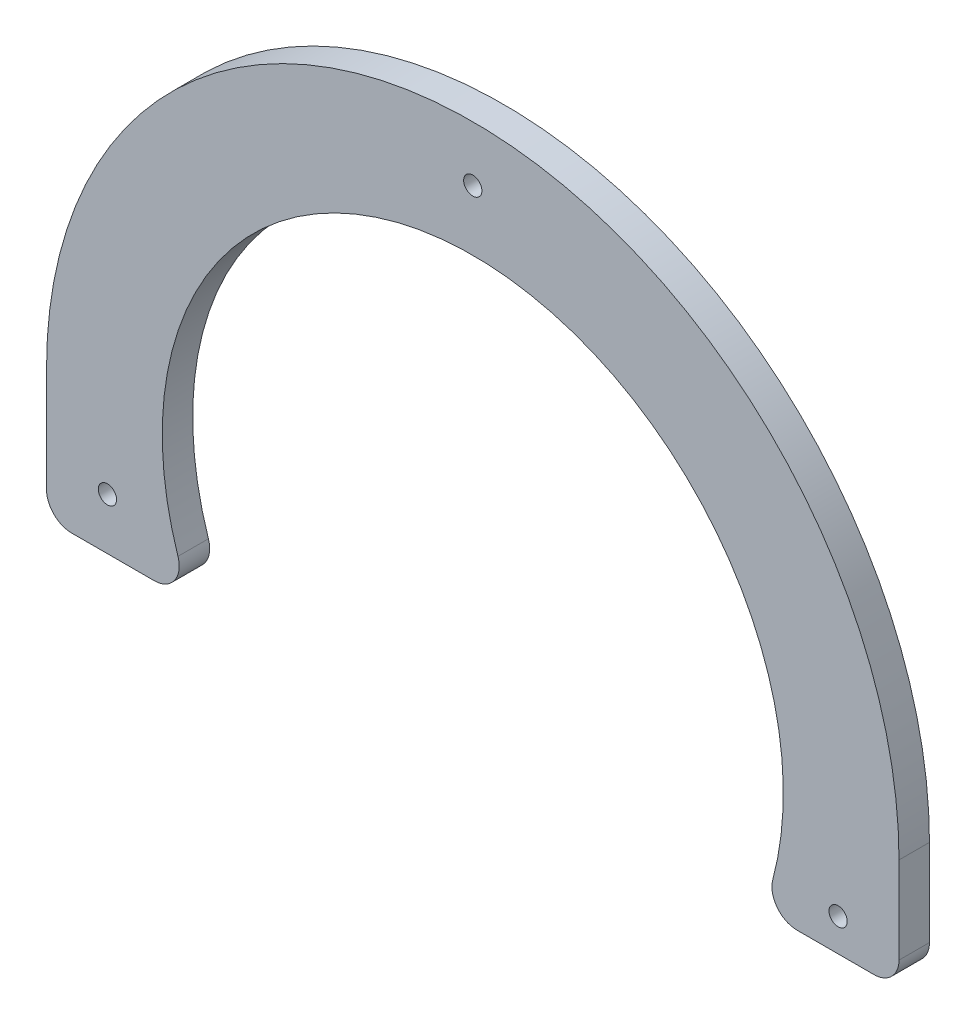
ISO-10303-21;
HEADER;
FILE_DESCRIPTION(('STEP AP214'),'2;1');
FILE_NAME('part.step','',(''),(''),'','','');
FILE_SCHEMA(('AUTOMOTIVE_DESIGN { 1 0 10303 214 1 1 1 1 }'));
ENDSEC;
DATA;
#1=APPLICATION_CONTEXT('core data for automotive mechanical design processes');
#2=APPLICATION_PROTOCOL_DEFINITION('international standard','automotive_design',2000,#1);
#3=PRODUCT_CONTEXT('',#1,'mechanical');
#4=PRODUCT('Part','Part','',(#3));
#5=PRODUCT_RELATED_PRODUCT_CATEGORY('part','',(#4));
#6=PRODUCT_DEFINITION_FORMATION('','',#4);
#7=PRODUCT_DEFINITION_CONTEXT('part definition',#1,'design');
#8=PRODUCT_DEFINITION('design','',#6,#7);
#9=PRODUCT_DEFINITION_SHAPE('','',#8);
#10=(LENGTH_UNIT() NAMED_UNIT(*) SI_UNIT(.MILLI.,.METRE.));
#11=(NAMED_UNIT(*) PLANE_ANGLE_UNIT() SI_UNIT($,.RADIAN.));
#12=(NAMED_UNIT(*) SI_UNIT($,.STERADIAN.) SOLID_ANGLE_UNIT());
#13=UNCERTAINTY_MEASURE_WITH_UNIT(LENGTH_MEASURE(1.E-05),#10,'distance_accuracy_value','');
#14=(GEOMETRIC_REPRESENTATION_CONTEXT(3) GLOBAL_UNCERTAINTY_ASSIGNED_CONTEXT((#13)) GLOBAL_UNIT_ASSIGNED_CONTEXT((#10,
#11,#12)) REPRESENTATION_CONTEXT('',''));
#15=CARTESIAN_POINT('',(0.,0.,0.));
#16=DIRECTION('',(0.,0.,1.));
#17=DIRECTION('',(1.,0.,0.));
#18=AXIS2_PLACEMENT_3D('',#15,#16,#17);
#19=CARTESIAN_POINT('',(-55.7930693956001,14.5419067313298,2.5));
#20=DIRECTION('',(0.,0.,1.));
#21=DIRECTION('',(1.,0.,0.));
#22=AXIS2_PLACEMENT_3D('',#19,#20,#21);
#23=PLANE('',#22);
#24=CARTESIAN_POINT('',(-109.040520262982,89.7039315522898,2.5));
#25=DIRECTION('',(0.,0.,1.));
#26=DIRECTION('',(1.,0.,0.));
#27=AXIS2_PLACEMENT_3D('',#24,#25,#26);
#28=CIRCLE('',#27,1.5);
#29=CARTESIAN_POINT('',(-107.540520262982,89.7039315522898,2.5));
#30=VERTEX_POINT('',#29);
#31=EDGE_CURVE('E215',#30,#30,#28,.T.);
#32=ORIENTED_EDGE('',*,*,#31,.F.);
#33=EDGE_LOOP('',(#32));
#34=FACE_BOUND('',#33,.T.);
#35=CARTESIAN_POINT('',(-55.7930693956001,14.5419067313298,2.5));
#36=DIRECTION('',(0.,0.,1.));
#37=DIRECTION('',(1.,0.,0.));
#38=AXIS2_PLACEMENT_3D('',#35,#36,#37);
#39=CIRCLE('',#38,4.12000000000006);
#40=CARTESIAN_POINT('',(-59.7731038218268,15.6066724173147,2.5));
#41=VERTEX_POINT('',#40);
#42=CARTESIAN_POINT('',(-55.7930693956001,10.4219067313297,2.5));
#43=VERTEX_POINT('',#42);
#44=EDGE_CURVE('E164',#41,#43,#39,.T.);
#45=ORIENTED_EDGE('',*,*,#44,.T.);
#46=DIRECTION('',(1.,0.,0.));
#47=VECTOR('',#46,1.);
#48=CARTESIAN_POINT('',(-43.1605201992711,10.4219067313297,2.5));
#49=LINE('',#48,#47);
#50=CARTESIAN_POINT('',(-43.1605201992711,10.4219067313297,2.5));
#51=VERTEX_POINT('',#50);
#52=EDGE_CURVE('E102',#43,#51,#49,.T.);
#53=ORIENTED_EDGE('',*,*,#52,.T.);
#54=CARTESIAN_POINT('',(-43.1605201992711,14.5419067313297,2.5));
#55=DIRECTION('',(0.,0.,1.));
#56=DIRECTION('',(1.,0.,0.));
#57=AXIS2_PLACEMENT_3D('',#54,#55,#56);
#58=CIRCLE('',#57,4.12);
#59=CARTESIAN_POINT('',(-39.0405202629815,14.5411821804479,2.5));
#60=VERTEX_POINT('',#59);
#61=EDGE_CURVE('E185',#51,#60,#58,.T.);
#62=ORIENTED_EDGE('',*,*,#61,.T.);
#63=DIRECTION('',(0.,1.,0.));
#64=VECTOR('',#63,1.);
#65=CARTESIAN_POINT('',(-39.0405202629815,14.5411821804479,2.5));
#66=LINE('',#65,#64);
#67=CARTESIAN_POINT('',(-39.0405202629815,28.7870243554774,2.5));
#68=VERTEX_POINT('',#67);
#69=EDGE_CURVE('E204',#60,#68,#66,.T.);
#70=ORIENTED_EDGE('',*,*,#69,.T.);
#71=CARTESIAN_POINT('',(-109.040520262982,28.7870243554774,2.5));
#72=DIRECTION('',(0.,0.,1.));
#73=DIRECTION('',(1.,0.,0.));
#74=AXIS2_PLACEMENT_3D('',#71,#72,#73);
#75=CIRCLE('',#74,70.);
#76=CARTESIAN_POINT('',(-179.040520262982,28.7870243554774,2.5));
#77=VERTEX_POINT('',#76);
#78=EDGE_CURVE('E201',#68,#77,#75,.T.);
#79=ORIENTED_EDGE('',*,*,#78,.T.);
#80=DIRECTION('',(0.,-1.,0.));
#81=VECTOR('',#80,1.);
#82=CARTESIAN_POINT('',(-179.040520262982,11.4626936900341,2.5));
#83=LINE('',#82,#81);
#84=CARTESIAN_POINT('',(-179.040520262982,11.4626936900341,2.5));
#85=VERTEX_POINT('',#84);
#86=EDGE_CURVE('E203',#77,#85,#83,.T.);
#87=ORIENTED_EDGE('',*,*,#86,.T.);
#88=CARTESIAN_POINT('',(-174.920520262982,11.4626936900341,2.5));
#89=DIRECTION('',(0.,0.,1.));
#90=DIRECTION('',(-1.,0.,0.));
#91=AXIS2_PLACEMENT_3D('',#88,#89,#90);
#92=CIRCLE('',#91,4.12000000000001);
#93=CARTESIAN_POINT('',(-174.920520262982,7.3426936900341,2.5));
#94=VERTEX_POINT('',#93);
#95=EDGE_CURVE('E127',#85,#94,#92,.T.);
#96=ORIENTED_EDGE('',*,*,#95,.T.);
#97=DIRECTION('',(1.,0.,0.));
#98=VECTOR('',#97,1.);
#99=CARTESIAN_POINT('',(-174.920520262982,7.3426936900341,2.5));
#100=LINE('',#99,#98);
#101=CARTESIAN_POINT('',(-161.367205300297,7.34269369003409,2.5));
#102=VERTEX_POINT('',#101);
#103=EDGE_CURVE('E121',#94,#102,#100,.T.);
#104=ORIENTED_EDGE('',*,*,#103,.T.);
#105=CARTESIAN_POINT('',(-161.367205300297,11.4626936900341,2.5));
#106=DIRECTION('',(0.,0.,1.));
#107=DIRECTION('',(-1.,0.,0.));
#108=AXIS2_PLACEMENT_3D('',#105,#106,#107);
#109=CIRCLE('',#108,4.12);
#110=CARTESIAN_POINT('',(-157.455994444822,12.7576182608183,2.5));
#111=VERTEX_POINT('',#110);
#112=EDGE_CURVE('E125',#102,#111,#109,.T.);
#113=ORIENTED_EDGE('',*,*,#112,.T.);
#114=CARTESIAN_POINT('',(-109.040520262982,28.7870243554774,2.5));
#115=DIRECTION('',(0.,0.,-1.));
#116=DIRECTION('',(1.,0.,0.));
#117=AXIS2_PLACEMENT_3D('',#114,#115,#116);
#118=CIRCLE('',#117,51.);
#119=EDGE_CURVE('E53',#111,#41,#118,.T.);
#120=ORIENTED_EDGE('',*,*,#119,.T.);
#121=EDGE_LOOP('',(#45,#53,#62,#70,#79,#87,#96,#104,#113,#120));
#122=FACE_BOUND('',#121,.T.);
#123=CARTESIAN_POINT('',(-169.040520262982,15.7832670451156,2.5));
#124=DIRECTION('',(0.,0.,1.));
#125=DIRECTION('',(1.,0.,0.));
#126=AXIS2_PLACEMENT_3D('',#123,#124,#125);
#127=CIRCLE('',#126,1.5);
#128=CARTESIAN_POINT('',(-167.540520262982,15.7832670451156,2.5));
#129=VERTEX_POINT('',#128);
#130=EDGE_CURVE('E149',#129,#129,#127,.T.);
#131=ORIENTED_EDGE('',*,*,#130,.F.);
#132=EDGE_LOOP('',(#131));
#133=FACE_BOUND('',#132,.T.);
#134=CARTESIAN_POINT('',(-49.0405202629816,15.7832670451156,2.5));
#135=DIRECTION('',(0.,0.,1.));
#136=DIRECTION('',(1.,0.,0.));
#137=AXIS2_PLACEMENT_3D('',#134,#135,#136);
#138=CIRCLE('',#137,1.5);
#139=CARTESIAN_POINT('',(-47.5405202629816,15.7832670451156,2.5));
#140=VERTEX_POINT('',#139);
#141=EDGE_CURVE('E221',#140,#140,#138,.T.);
#142=ORIENTED_EDGE('',*,*,#141,.F.);
#143=EDGE_LOOP('',(#142));
#144=FACE_BOUND('',#143,.T.);
#145=ADVANCED_FACE('F36',(#34,#122,#133,#144),#23,.T.);
#146=CARTESIAN_POINT('',(-55.7930693956001,14.5419067313298,-2.5));
#147=DIRECTION('',(0.,0.,1.));
#148=DIRECTION('',(1.,0.,0.));
#149=AXIS2_PLACEMENT_3D('',#146,#147,#148);
#150=PLANE('',#149);
#151=CARTESIAN_POINT('',(-55.7930693956001,14.5419067313298,-2.5));
#152=DIRECTION('',(0.,0.,1.));
#153=DIRECTION('',(1.,0.,0.));
#154=AXIS2_PLACEMENT_3D('',#151,#152,#153);
#155=CIRCLE('',#154,4.12000000000006);
#156=CARTESIAN_POINT('',(-59.7731038218268,15.6066724173147,-2.5));
#157=VERTEX_POINT('',#156);
#158=CARTESIAN_POINT('',(-55.7930693956001,10.4219067313297,-2.5));
#159=VERTEX_POINT('',#158);
#160=EDGE_CURVE('E145',#157,#159,#155,.T.);
#161=ORIENTED_EDGE('',*,*,#160,.F.);
#162=CARTESIAN_POINT('',(-109.040520262982,28.7870243554774,-2.5));
#163=DIRECTION('',(0.,0.,-1.));
#164=DIRECTION('',(1.,0.,0.));
#165=AXIS2_PLACEMENT_3D('',#162,#163,#164);
#166=CIRCLE('',#165,51.);
#167=CARTESIAN_POINT('',(-157.455994444822,12.7576182608183,-2.5));
#168=VERTEX_POINT('',#167);
#169=EDGE_CURVE('E94',#168,#157,#166,.T.);
#170=ORIENTED_EDGE('',*,*,#169,.F.);
#171=CARTESIAN_POINT('',(-161.367205300297,11.4626936900341,-2.5));
#172=DIRECTION('',(0.,0.,1.));
#173=DIRECTION('',(-1.,0.,0.));
#174=AXIS2_PLACEMENT_3D('',#171,#172,#173);
#175=CIRCLE('',#174,4.12);
#176=CARTESIAN_POINT('',(-161.367205300297,7.34269369003409,-2.5));
#177=VERTEX_POINT('',#176);
#178=EDGE_CURVE('E88',#177,#168,#175,.T.);
#179=ORIENTED_EDGE('',*,*,#178,.F.);
#180=DIRECTION('',(1.,0.,0.));
#181=VECTOR('',#180,1.);
#182=CARTESIAN_POINT('',(-174.920520262982,7.3426936900341,-2.5));
#183=LINE('',#182,#181);
#184=CARTESIAN_POINT('',(-174.920520262982,7.3426936900341,-2.5));
#185=VERTEX_POINT('',#184);
#186=EDGE_CURVE('E135',#185,#177,#183,.T.);
#187=ORIENTED_EDGE('',*,*,#186,.F.);
#188=CARTESIAN_POINT('',(-174.920520262982,11.4626936900341,-2.5));
#189=DIRECTION('',(0.,0.,1.));
#190=DIRECTION('',(-1.,0.,0.));
#191=AXIS2_PLACEMENT_3D('',#188,#189,#190);
#192=CIRCLE('',#191,4.12000000000001);
#193=CARTESIAN_POINT('',(-179.040520262982,11.4626936900341,-2.5));
#194=VERTEX_POINT('',#193);
#195=EDGE_CURVE('E159',#194,#185,#192,.T.);
#196=ORIENTED_EDGE('',*,*,#195,.F.);
#197=DIRECTION('',(0.,-1.,0.));
#198=VECTOR('',#197,1.);
#199=CARTESIAN_POINT('',(-179.040520262982,11.4626936900341,-2.5));
#200=LINE('',#199,#198);
#201=CARTESIAN_POINT('',(-179.040520262982,28.7870243554774,-2.5));
#202=VERTEX_POINT('',#201);
#203=EDGE_CURVE('E157',#202,#194,#200,.T.);
#204=ORIENTED_EDGE('',*,*,#203,.F.);
#205=CARTESIAN_POINT('',(-109.040520262982,28.7870243554774,-2.5));
#206=DIRECTION('',(0.,0.,1.));
#207=DIRECTION('',(1.,0.,0.));
#208=AXIS2_PLACEMENT_3D('',#205,#206,#207);
#209=CIRCLE('',#208,70.);
#210=CARTESIAN_POINT('',(-39.0405202629815,28.7870243554774,-2.5));
#211=VERTEX_POINT('',#210);
#212=EDGE_CURVE('E155',#211,#202,#209,.T.);
#213=ORIENTED_EDGE('',*,*,#212,.F.);
#214=DIRECTION('',(0.,1.,0.));
#215=VECTOR('',#214,1.);
#216=CARTESIAN_POINT('',(-39.0405202629815,14.5411821804479,-2.5));
#217=LINE('',#216,#215);
#218=CARTESIAN_POINT('',(-39.0405202629815,14.5411821804479,-2.5));
#219=VERTEX_POINT('',#218);
#220=EDGE_CURVE('E153',#219,#211,#217,.T.);
#221=ORIENTED_EDGE('',*,*,#220,.F.);
#222=CARTESIAN_POINT('',(-43.1605201992711,14.5419067313297,-2.5));
#223=DIRECTION('',(0.,0.,1.));
#224=DIRECTION('',(1.,0.,0.));
#225=AXIS2_PLACEMENT_3D('',#222,#223,#224);
#226=CIRCLE('',#225,4.12);
#227=CARTESIAN_POINT('',(-43.1605201992711,10.4219067313297,-2.5));
#228=VERTEX_POINT('',#227);
#229=EDGE_CURVE('E151',#228,#219,#226,.T.);
#230=ORIENTED_EDGE('',*,*,#229,.F.);
#231=DIRECTION('',(1.,0.,0.));
#232=VECTOR('',#231,1.);
#233=CARTESIAN_POINT('',(-43.1605201992711,10.4219067313297,-2.5));
#234=LINE('',#233,#232);
#235=EDGE_CURVE('E148',#159,#228,#234,.T.);
#236=ORIENTED_EDGE('',*,*,#235,.F.);
#237=EDGE_LOOP('',(#161,#170,#179,#187,#196,#204,#213,#221,#230,#236));
#238=FACE_BOUND('',#237,.T.);
#239=CARTESIAN_POINT('',(-169.040520262982,15.7832670451156,-2.5));
#240=DIRECTION('',(0.,0.,1.));
#241=DIRECTION('',(1.,0.,0.));
#242=AXIS2_PLACEMENT_3D('',#239,#240,#241);
#243=CIRCLE('',#242,1.5);
#244=CARTESIAN_POINT('',(-167.540520262982,15.7832670451156,-2.5));
#245=VERTEX_POINT('',#244);
#246=EDGE_CURVE('E212',#245,#245,#243,.T.);
#247=ORIENTED_EDGE('',*,*,#246,.T.);
#248=EDGE_LOOP('',(#247));
#249=FACE_BOUND('',#248,.T.);
#250=CARTESIAN_POINT('',(-109.040520262982,89.7039315522898,-2.5));
#251=DIRECTION('',(0.,0.,1.));
#252=DIRECTION('',(1.,0.,0.));
#253=AXIS2_PLACEMENT_3D('',#250,#251,#252);
#254=CIRCLE('',#253,1.5);
#255=CARTESIAN_POINT('',(-107.540520262982,89.7039315522898,-2.5));
#256=VERTEX_POINT('',#255);
#257=EDGE_CURVE('E218',#256,#256,#254,.T.);
#258=ORIENTED_EDGE('',*,*,#257,.T.);
#259=EDGE_LOOP('',(#258));
#260=FACE_BOUND('',#259,.T.);
#261=CARTESIAN_POINT('',(-49.0405202629816,15.7832670451156,-2.5));
#262=DIRECTION('',(0.,0.,1.));
#263=DIRECTION('',(1.,0.,0.));
#264=AXIS2_PLACEMENT_3D('',#261,#262,#263);
#265=CIRCLE('',#264,1.5);
#266=CARTESIAN_POINT('',(-47.5405202629816,15.7832670451156,-2.5));
#267=VERTEX_POINT('',#266);
#268=EDGE_CURVE('E224',#267,#267,#265,.T.);
#269=ORIENTED_EDGE('',*,*,#268,.T.);
#270=EDGE_LOOP('',(#269));
#271=FACE_BOUND('',#270,.T.);
#272=ADVANCED_FACE('F189',(#238,#249,#260,#271),#150,.F.);
#273=CARTESIAN_POINT('',(-55.7930693956001,14.5419067313298,2.5));
#274=DIRECTION('',(0.,0.,-1.));
#275=DIRECTION('',(-1.,0.,0.));
#276=AXIS2_PLACEMENT_3D('',#273,#274,#275);
#277=CYLINDRICAL_SURFACE('',#276,4.12000000000006);
#278=ORIENTED_EDGE('',*,*,#160,.T.);
#279=DIRECTION('',(0.,0.,-1.));
#280=VECTOR('',#279,1.);
#281=CARTESIAN_POINT('',(-55.7930693956001,10.4219067313297,2.5));
#282=LINE('',#281,#280);
#283=EDGE_CURVE('E11',#43,#159,#282,.T.);
#284=ORIENTED_EDGE('',*,*,#283,.F.);
#285=ORIENTED_EDGE('',*,*,#44,.F.);
#286=DIRECTION('',(0.,0.,-1.));
#287=VECTOR('',#286,1.);
#288=CARTESIAN_POINT('',(-59.7731038218268,15.6066724173147,2.5));
#289=LINE('',#288,#287);
#290=EDGE_CURVE('E141',#41,#157,#289,.T.);
#291=ORIENTED_EDGE('',*,*,#290,.T.);
#292=EDGE_LOOP('',(#278,#284,#285,#291));
#293=FACE_BOUND('',#292,.T.);
#294=ADVANCED_FACE('F38',(#293),#277,.T.);
#295=CARTESIAN_POINT('',(-43.1605201992711,10.4219067313297,2.5));
#296=DIRECTION('',(0.,1.,0.));
#297=DIRECTION('',(-1.,0.,0.));
#298=AXIS2_PLACEMENT_3D('',#295,#296,#297);
#299=PLANE('',#298);
#300=ORIENTED_EDGE('',*,*,#235,.T.);
#301=DIRECTION('',(0.,0.,-1.));
#302=VECTOR('',#301,1.);
#303=CARTESIAN_POINT('',(-43.1605201992711,10.4219067313297,2.5));
#304=LINE('',#303,#302);
#305=EDGE_CURVE('E45',#51,#228,#304,.T.);
#306=ORIENTED_EDGE('',*,*,#305,.F.);
#307=ORIENTED_EDGE('',*,*,#52,.F.);
#308=ORIENTED_EDGE('',*,*,#283,.T.);
#309=EDGE_LOOP('',(#300,#306,#307,#308));
#310=FACE_BOUND('',#309,.T.);
#311=ADVANCED_FACE('F265',(#310),#299,.F.);
#312=CARTESIAN_POINT('',(-43.1605201992711,14.5419067313297,2.5));
#313=DIRECTION('',(0.,0.,-1.));
#314=DIRECTION('',(-1.,0.,0.));
#315=AXIS2_PLACEMENT_3D('',#312,#313,#314);
#316=CYLINDRICAL_SURFACE('',#315,4.12);
#317=ORIENTED_EDGE('',*,*,#229,.T.);
#318=DIRECTION('',(0.,0.,-1.));
#319=VECTOR('',#318,1.);
#320=CARTESIAN_POINT('',(-39.0405202629815,14.5411821804479,2.5));
#321=LINE('',#320,#319);
#322=EDGE_CURVE('E177',#60,#219,#321,.T.);
#323=ORIENTED_EDGE('',*,*,#322,.F.);
#324=ORIENTED_EDGE('',*,*,#61,.F.);
#325=ORIENTED_EDGE('',*,*,#305,.T.);
#326=EDGE_LOOP('',(#317,#323,#324,#325));
#327=FACE_BOUND('',#326,.T.);
#328=ADVANCED_FACE('F183',(#327),#316,.T.);
#329=CARTESIAN_POINT('',(-39.0405202629815,14.5411821804479,2.5));
#330=DIRECTION('',(-1.,0.,0.));
#331=DIRECTION('',(0.,0.,1.));
#332=AXIS2_PLACEMENT_3D('',#329,#330,#331);
#333=PLANE('',#332);
#334=ORIENTED_EDGE('',*,*,#220,.T.);
#335=DIRECTION('',(0.,0.,-1.));
#336=VECTOR('',#335,1.);
#337=CARTESIAN_POINT('',(-39.0405202629815,28.7870243554774,2.5));
#338=LINE('',#337,#336);
#339=EDGE_CURVE('E174',#68,#211,#338,.T.);
#340=ORIENTED_EDGE('',*,*,#339,.F.);
#341=ORIENTED_EDGE('',*,*,#69,.F.);
#342=ORIENTED_EDGE('',*,*,#322,.T.);
#343=EDGE_LOOP('',(#334,#340,#341,#342));
#344=FACE_BOUND('',#343,.T.);
#345=ADVANCED_FACE('F195',(#344),#333,.F.);
#346=CARTESIAN_POINT('',(-109.040520262982,28.7870243554774,2.5));
#347=DIRECTION('',(0.,0.,-1.));
#348=DIRECTION('',(-1.,0.,0.));
#349=AXIS2_PLACEMENT_3D('',#346,#347,#348);
#350=CYLINDRICAL_SURFACE('',#349,70.);
#351=ORIENTED_EDGE('',*,*,#212,.T.);
#352=DIRECTION('',(0.,0.,-1.));
#353=VECTOR('',#352,1.);
#354=CARTESIAN_POINT('',(-179.040520262982,28.7870243554774,2.5));
#355=LINE('',#354,#353);
#356=EDGE_CURVE('E171',#77,#202,#355,.T.);
#357=ORIENTED_EDGE('',*,*,#356,.F.);
#358=ORIENTED_EDGE('',*,*,#78,.F.);
#359=ORIENTED_EDGE('',*,*,#339,.T.);
#360=EDGE_LOOP('',(#351,#357,#358,#359));
#361=FACE_BOUND('',#360,.T.);
#362=ADVANCED_FACE('F199',(#361),#350,.T.);
#363=CARTESIAN_POINT('',(-179.040520262982,11.4626936900341,2.5));
#364=DIRECTION('',(1.,0.,0.));
#365=DIRECTION('',(0.,0.,-1.));
#366=AXIS2_PLACEMENT_3D('',#363,#364,#365);
#367=PLANE('',#366);
#368=ORIENTED_EDGE('',*,*,#203,.T.);
#369=DIRECTION('',(0.,0.,-1.));
#370=VECTOR('',#369,1.);
#371=CARTESIAN_POINT('',(-179.040520262982,11.4626936900341,2.5));
#372=LINE('',#371,#370);
#373=EDGE_CURVE('E168',#85,#194,#372,.T.);
#374=ORIENTED_EDGE('',*,*,#373,.F.);
#375=ORIENTED_EDGE('',*,*,#86,.F.);
#376=ORIENTED_EDGE('',*,*,#356,.T.);
#377=EDGE_LOOP('',(#368,#374,#375,#376));
#378=FACE_BOUND('',#377,.T.);
#379=ADVANCED_FACE('F255',(#378),#367,.F.);
#380=CARTESIAN_POINT('',(-174.920520262982,11.4626936900341,2.5));
#381=DIRECTION('',(0.,0.,-1.));
#382=DIRECTION('',(-1.,0.,0.));
#383=AXIS2_PLACEMENT_3D('',#380,#381,#382);
#384=CYLINDRICAL_SURFACE('',#383,4.12000000000001);
#385=ORIENTED_EDGE('',*,*,#195,.T.);
#386=DIRECTION('',(0.,0.,-1.));
#387=VECTOR('',#386,1.);
#388=CARTESIAN_POINT('',(-174.920520262982,7.3426936900341,2.5));
#389=LINE('',#388,#387);
#390=EDGE_CURVE('E136',#94,#185,#389,.T.);
#391=ORIENTED_EDGE('',*,*,#390,.F.);
#392=ORIENTED_EDGE('',*,*,#95,.F.);
#393=ORIENTED_EDGE('',*,*,#373,.T.);
#394=EDGE_LOOP('',(#385,#391,#392,#393));
#395=FACE_BOUND('',#394,.T.);
#396=ADVANCED_FACE('F252',(#395),#384,.T.);
#397=CARTESIAN_POINT('',(-174.920520262982,7.3426936900341,2.5));
#398=DIRECTION('',(0.,1.,0.));
#399=DIRECTION('',(-1.,0.,0.));
#400=AXIS2_PLACEMENT_3D('',#397,#398,#399);
#401=PLANE('',#400);
#402=ORIENTED_EDGE('',*,*,#186,.T.);
#403=DIRECTION('',(0.,0.,-1.));
#404=VECTOR('',#403,1.);
#405=CARTESIAN_POINT('',(-161.367205300297,7.34269369003409,2.5));
#406=LINE('',#405,#404);
#407=EDGE_CURVE('E132',#102,#177,#406,.T.);
#408=ORIENTED_EDGE('',*,*,#407,.F.);
#409=ORIENTED_EDGE('',*,*,#103,.F.);
#410=ORIENTED_EDGE('',*,*,#390,.T.);
#411=EDGE_LOOP('',(#402,#408,#409,#410));
#412=FACE_BOUND('',#411,.T.);
#413=ADVANCED_FACE('F133',(#412),#401,.F.);
#414=CARTESIAN_POINT('',(-161.367205300297,11.4626936900341,2.5));
#415=DIRECTION('',(0.,0.,-1.));
#416=DIRECTION('',(-1.,0.,0.));
#417=AXIS2_PLACEMENT_3D('',#414,#415,#416);
#418=CYLINDRICAL_SURFACE('',#417,4.12);
#419=ORIENTED_EDGE('',*,*,#178,.T.);
#420=DIRECTION('',(0.,0.,-1.));
#421=VECTOR('',#420,1.);
#422=CARTESIAN_POINT('',(-157.455994444822,12.7576182608183,2.5));
#423=LINE('',#422,#421);
#424=EDGE_CURVE('E137',#111,#168,#423,.T.);
#425=ORIENTED_EDGE('',*,*,#424,.F.);
#426=ORIENTED_EDGE('',*,*,#112,.F.);
#427=ORIENTED_EDGE('',*,*,#407,.T.);
#428=EDGE_LOOP('',(#419,#425,#426,#427));
#429=FACE_BOUND('',#428,.T.);
#430=ADVANCED_FACE('F139',(#429),#418,.T.);
#431=CARTESIAN_POINT('',(-109.040520262982,28.7870243554774,2.5));
#432=DIRECTION('',(0.,0.,-1.));
#433=DIRECTION('',(-1.,0.,0.));
#434=AXIS2_PLACEMENT_3D('',#431,#432,#433);
#435=CYLINDRICAL_SURFACE('',#434,51.);
#436=ORIENTED_EDGE('',*,*,#169,.T.);
#437=ORIENTED_EDGE('',*,*,#290,.F.);
#438=ORIENTED_EDGE('',*,*,#119,.F.);
#439=ORIENTED_EDGE('',*,*,#424,.T.);
#440=EDGE_LOOP('',(#436,#437,#438,#439));
#441=FACE_BOUND('',#440,.T.);
#442=ADVANCED_FACE('F245',(#441),#435,.F.);
#443=CARTESIAN_POINT('',(-169.040520262982,15.7832670451156,2.5));
#444=DIRECTION('',(0.,0.,-1.));
#445=DIRECTION('',(-1.,0.,0.));
#446=AXIS2_PLACEMENT_3D('',#443,#444,#445);
#447=CYLINDRICAL_SURFACE('',#446,1.5);
#448=ORIENTED_EDGE('',*,*,#130,.T.);
#449=EDGE_LOOP('',(#448));
#450=FACE_BOUND('',#449,.T.);
#451=ORIENTED_EDGE('',*,*,#246,.F.);
#452=EDGE_LOOP('',(#451));
#453=FACE_BOUND('',#452,.T.);
#454=ADVANCED_FACE('F242',(#450,#453),#447,.F.);
#455=CARTESIAN_POINT('',(-109.040520262982,89.7039315522898,2.5));
#456=DIRECTION('',(0.,0.,-1.));
#457=DIRECTION('',(-1.,0.,0.));
#458=AXIS2_PLACEMENT_3D('',#455,#456,#457);
#459=CYLINDRICAL_SURFACE('',#458,1.5);
#460=ORIENTED_EDGE('',*,*,#31,.T.);
#461=EDGE_LOOP('',(#460));
#462=FACE_BOUND('',#461,.T.);
#463=ORIENTED_EDGE('',*,*,#257,.F.);
#464=EDGE_LOOP('',(#463));
#465=FACE_BOUND('',#464,.T.);
#466=ADVANCED_FACE('F341',(#462,#465),#459,.F.);
#467=CARTESIAN_POINT('',(-49.0405202629816,15.7832670451156,2.5));
#468=DIRECTION('',(0.,0.,-1.));
#469=DIRECTION('',(-1.,0.,0.));
#470=AXIS2_PLACEMENT_3D('',#467,#468,#469);
#471=CYLINDRICAL_SURFACE('',#470,1.5);
#472=ORIENTED_EDGE('',*,*,#141,.T.);
#473=EDGE_LOOP('',(#472));
#474=FACE_BOUND('',#473,.T.);
#475=ORIENTED_EDGE('',*,*,#268,.F.);
#476=EDGE_LOOP('',(#475));
#477=FACE_BOUND('',#476,.T.);
#478=ADVANCED_FACE('F230',(#474,#477),#471,.F.);
#479=CLOSED_SHELL('',(#145,#272,#294,#311,#328,#345,#362,#379,#396,#413,#430,#442,#454,#466,#478));
#480=MANIFOLD_SOLID_BREP('B2',#479);
#481=ADVANCED_BREP_SHAPE_REPRESENTATION('',(#18,#480),#14);
#482=SHAPE_DEFINITION_REPRESENTATION(#9,#481);
ENDSEC;
END-ISO-10303-21;
